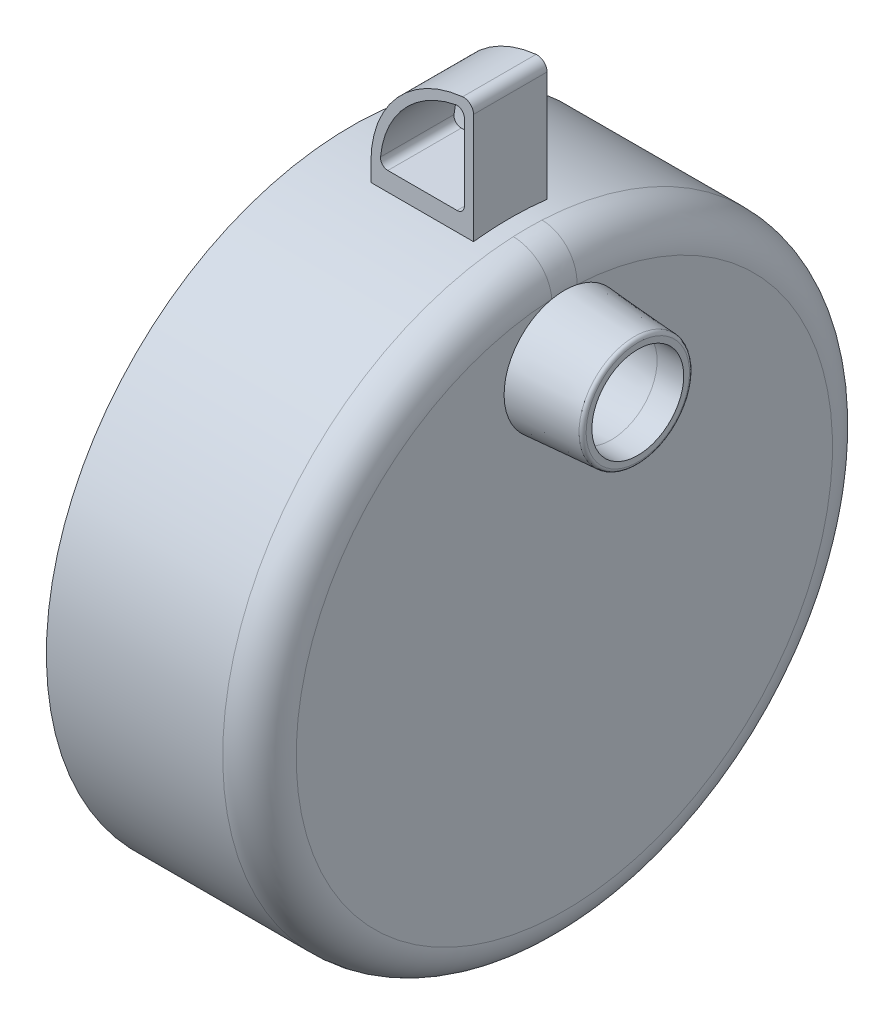
ISO-10303-21;
HEADER;
FILE_DESCRIPTION(('STEP AP214'),'2;1');
FILE_NAME('part.step','',(''),(''),'','','');
FILE_SCHEMA(('AUTOMOTIVE_DESIGN { 1 0 10303 214 1 1 1 1 }'));
ENDSEC;
DATA;
#1=APPLICATION_CONTEXT('core data for automotive mechanical design processes');
#2=APPLICATION_PROTOCOL_DEFINITION('international standard','automotive_design',2000,#1);
#3=PRODUCT_CONTEXT('',#1,'mechanical');
#4=PRODUCT('Part','Part','',(#3));
#5=PRODUCT_RELATED_PRODUCT_CATEGORY('part','',(#4));
#6=PRODUCT_DEFINITION_FORMATION('','',#4);
#7=PRODUCT_DEFINITION_CONTEXT('part definition',#1,'design');
#8=PRODUCT_DEFINITION('design','',#6,#7);
#9=PRODUCT_DEFINITION_SHAPE('','',#8);
#10=(LENGTH_UNIT() NAMED_UNIT(*) SI_UNIT(.MILLI.,.METRE.));
#11=(NAMED_UNIT(*) PLANE_ANGLE_UNIT() SI_UNIT($,.RADIAN.));
#12=(NAMED_UNIT(*) SI_UNIT($,.STERADIAN.) SOLID_ANGLE_UNIT());
#13=UNCERTAINTY_MEASURE_WITH_UNIT(LENGTH_MEASURE(1.E-05),#10,'distance_accuracy_value','');
#14=(GEOMETRIC_REPRESENTATION_CONTEXT(3) GLOBAL_UNCERTAINTY_ASSIGNED_CONTEXT((#13)) GLOBAL_UNIT_ASSIGNED_CONTEXT((#10,
#11,#12)) REPRESENTATION_CONTEXT('',''));
#15=CARTESIAN_POINT('',(0.,0.,0.));
#16=DIRECTION('',(0.,0.,1.));
#17=DIRECTION('',(1.,0.,0.));
#18=AXIS2_PLACEMENT_3D('',#15,#16,#17);
#19=CARTESIAN_POINT('',(0.,0.,0.));
#20=DIRECTION('',(1.,0.,0.));
#21=DIRECTION('',(0.,1.,0.));
#22=AXIS2_PLACEMENT_3D('',#19,#20,#21);
#23=CYLINDRICAL_SURFACE('',#22,8.3);
#24=DIRECTION('',(1.,0.,0.));
#25=VECTOR('',#24,1.);
#26=CARTESIAN_POINT('',(0.,8.23953882204581,1.));
#27=LINE('',#26,#25);
#28=CARTESIAN_POINT('',(-4.92790702664676,8.23953882204581,1.));
#29=VERTEX_POINT('',#28);
#30=CARTESIAN_POINT('',(-2.13404134118542,8.23953882204581,1.));
#31=VERTEX_POINT('',#30);
#32=EDGE_CURVE('E11',#29,#31,#27,.T.);
#33=ORIENTED_EDGE('',*,*,#32,.F.);
#34=CARTESIAN_POINT('',(-4.92790702664676,0.,0.));
#35=DIRECTION('',(-1.,0.,0.));
#36=DIRECTION('',(0.,0.,1.));
#37=AXIS2_PLACEMENT_3D('',#34,#35,#36);
#38=CIRCLE('',#37,8.3);
#39=CARTESIAN_POINT('',(-4.92790702664676,8.23953882204581,-1.));
#40=VERTEX_POINT('',#39);
#41=EDGE_CURVE('E55',#40,#29,#38,.F.);
#42=ORIENTED_EDGE('',*,*,#41,.F.);
#43=DIRECTION('',(1.,0.,0.));
#44=VECTOR('',#43,1.);
#45=CARTESIAN_POINT('',(0.,8.23953882204581,-1.));
#46=LINE('',#45,#44);
#47=CARTESIAN_POINT('',(-2.13404134118542,8.23953882204581,-1.));
#48=VERTEX_POINT('',#47);
#49=EDGE_CURVE('E575',#40,#48,#46,.T.);
#50=ORIENTED_EDGE('',*,*,#49,.T.);
#51=CARTESIAN_POINT('',(-2.13404134118542,0.,0.));
#52=DIRECTION('',(1.,0.,0.));
#53=DIRECTION('',(0.,0.,-1.));
#54=AXIS2_PLACEMENT_3D('',#51,#52,#53);
#55=CIRCLE('',#54,8.3);
#56=EDGE_CURVE('E586',#31,#48,#55,.F.);
#57=ORIENTED_EDGE('',*,*,#56,.F.);
#58=EDGE_LOOP('',(#33,#42,#50,#57));
#59=FACE_BOUND('',#58,.T.);
#60=CARTESIAN_POINT('',(-6.4626213592233,0.,0.));
#61=DIRECTION('',(-1.,0.,0.));
#62=DIRECTION('',(0.,-1.,0.));
#63=AXIS2_PLACEMENT_3D('',#60,#61,#62);
#64=CIRCLE('',#63,8.3);
#65=CARTESIAN_POINT('',(-6.46262135922329,-8.3,0.));
#66=VERTEX_POINT('',#65);
#67=EDGE_CURVE('E350',#66,#66,#64,.F.);
#68=ORIENTED_EDGE('',*,*,#67,.T.);
#69=EDGE_LOOP('',(#68));
#70=FACE_BOUND('',#69,.T.);
#71=CARTESIAN_POINT('',(-0.662621359223303,6.84654717536638,1.16100671717802));
#72=CARTESIAN_POINT('',(-0.155611557138721,8.20548721974094,1.30313866871385));
#73=CARTESIAN_POINT('',(-1.56479130863699,8.13081212811571,1.66730145363292));
#74=CARTESIAN_POINT('',(-0.662621359223303,6.86762956454592,1.13997296968727));
#75=CARTESIAN_POINT('',(-0.187933218919957,8.2057862436735,1.29042295352572));
#76=CARTESIAN_POINT('',(-1.5766915320226,8.14112200606201,1.61704018575949));
#77=CARTESIAN_POINT('',(-0.662621359223303,6.88896873968901,1.11754499626006));
#78=CARTESIAN_POINT('',(-0.219813738758314,8.2072302306618,1.27298407299892));
#79=CARTESIAN_POINT('',(-1.58710683832777,8.15104274715596,1.56627666116589));
#80=CARTESIAN_POINT('',(-0.662621359223303,6.93173915458441,1.06976085770777));
#81=CARTESIAN_POINT('',(-0.28089475284374,8.21175203031184,1.2301985167575));
#82=CARTESIAN_POINT('',(-1.60534684968239,8.17002138232369,1.46404769722416));
#83=CARTESIAN_POINT('',(-0.662621359223303,6.95317026746124,1.04440793610431));
#84=CARTESIAN_POINT('',(-0.310201631106451,8.21478989417577,1.20503272984977));
#85=CARTESIAN_POINT('',(-1.61317438780043,8.17908021221811,1.41258309014192));
#86=CARTESIAN_POINT('',(-0.662621359223303,6.99564286526884,0.990725496239536));
#87=CARTESIAN_POINT('',(-0.365483441209835,8.22184084226538,1.14822231651821));
#88=CARTESIAN_POINT('',(-1.62660828866893,8.19622971749665,1.30940602234005));
#89=CARTESIAN_POINT('',(-0.662621359223303,7.01668577720063,0.962411767494178));
#90=CARTESIAN_POINT('',(-0.391582989344379,8.22583109865152,1.11672349103787));
#91=CARTESIAN_POINT('',(-1.6322257423508,8.20432508115929,1.25769615220306));
#92=CARTESIAN_POINT('',(-0.662621359223303,7.05803723748134,0.902596928567542));
#93=CARTESIAN_POINT('',(-0.440410390807749,8.23428483875145,1.04828434670916));
#94=CARTESIAN_POINT('',(-1.64167170685165,8.21956386786933,1.1539157134018));
#95=CARTESIAN_POINT('',(-0.662621359223303,7.07834556892491,0.871094887210082));
#96=CARTESIAN_POINT('',(-0.46324689434083,8.23874570675295,1.0113978489586));
#97=CARTESIAN_POINT('',(-1.64549969319535,8.22670701139242,1.10184504352294));
#98=CARTESIAN_POINT('',(-0.662621359223303,7.13705342922995,0.772332516972111));
#99=CARTESIAN_POINT('',(-0.525588013164992,8.25200652379648,0.895718174619539));
#100=CARTESIAN_POINT('',(-1.65479387286374,8.24654431684184,0.94623993033339));
#101=CARTESIAN_POINT('',(-0.662621359223303,7.17364155353748,0.700327516842503));
#102=CARTESIAN_POINT('',(-0.561156963494785,8.26104922580889,0.809288891124329));
#103=CARTESIAN_POINT('',(-1.65817921485107,8.25780393925008,0.842365088864946));
#104=CARTESIAN_POINT('',(-0.662621359223303,7.23754127493035,0.544516811971032));
#105=CARTESIAN_POINT('',(-0.618656862721127,8.27693926178484,0.624932201739415));
#106=CARTESIAN_POINT('',(-1.66204845327861,8.27640543033942,0.634090320152695));
#107=CARTESIAN_POINT('',(-0.662621359223303,7.26483975738024,0.460694658387139));
#108=CARTESIAN_POINT('',(-0.641192673353963,8.28391440586742,0.526446296419795));
#109=CARTESIAN_POINT('',(-1.66252826374635,8.28374176860689,0.529689859994));
#110=CARTESIAN_POINT('',(-0.662621359223303,7.29672797286711,0.32416250357436));
#111=CARTESIAN_POINT('',(-0.66640472265956,8.29200872250634,0.3684583559612));
#112=CARTESIAN_POINT('',(-1.66265202187561,8.29206686288999,0.367391544298383));
#113=CARTESIAN_POINT('',(-0.662621359223303,7.30601426689956,0.274287772018961));
#114=CARTESIAN_POINT('',(-0.673499509801504,8.2943639169076,0.311274631978651));
#115=CARTESIAN_POINT('',(-1.66257367385266,8.29442715062154,0.309560744489569));
#116=CARTESIAN_POINT('',(-0.662621359223303,7.31995664012973,0.172981918493362));
#117=CARTESIAN_POINT('',(-0.683989113866572,8.29788672472185,0.195904608572503));
#118=CARTESIAN_POINT('',(-1.6623968653032,8.29793750274279,0.19386274501599));
#119=CARTESIAN_POINT('',(-0.662621359223303,7.32461279760342,0.121550822849825));
#120=CARTESIAN_POINT('',(-0.687422389676236,8.29906696110124,0.137517401754485));
#121=CARTESIAN_POINT('',(-1.66229840511676,8.2990875875919,0.135995545983132));
#122=CARTESIAN_POINT('',(-0.662621359223303,7.32902006068064,0.0182132112604692));
#123=CARTESIAN_POINT('',(-0.690662141607559,8.3001799387181,0.0206137193719886));
#124=CARTESIAN_POINT('',(-1.66220626311005,8.3001767747855,0.0202818642386279));
#125=CARTESIAN_POINT('',(-0.662621359223303,7.3287738843594,-0.0336930252886859));
#126=CARTESIAN_POINT('',(-0.690482646789475,8.3001175029108,-0.0381185169916275));
#127=CARTESIAN_POINT('',(-1.66221252322781,8.30011654818114,-0.03756461217083));
#128=CARTESIAN_POINT('',(-0.662621359223303,7.32339904334591,-0.136892567034595));
#129=CARTESIAN_POINT('',(-0.686526761284036,8.29876033119906,-0.154907593905905));
#130=CARTESIAN_POINT('',(-1.66232225814446,8.29878681201544,-0.153242198123968));
#131=CARTESIAN_POINT('',(-0.662621359223303,7.31827048877096,-0.188185886028688));
#132=CARTESIAN_POINT('',(-0.682735790476447,8.29746059664537,-0.213179441326511));
#133=CARTESIAN_POINT('',(-1.66242573075081,8.29751732972769,-0.2110733079848));
#134=CARTESIAN_POINT('',(-0.662621359223303,7.30335959515059,-0.289557551768222));
#135=CARTESIAN_POINT('',(-0.671477167986518,8.29369157659234,-0.328744202498162));
#136=CARTESIAN_POINT('',(-1.66259758188732,8.29375306719786,-0.32720810222908));
#137=CARTESIAN_POINT('',(-0.662621359223303,7.29353648045817,-0.339621132619031));
#138=CARTESIAN_POINT('',(-0.663935701363731,8.29119848413677,-0.386223715220537));
#139=CARTESIAN_POINT('',(-1.66266564180079,8.29124754478188,-0.38551144046606));
#140=CARTESIAN_POINT('',(-0.662621359223303,7.26976284678463,-0.43714822746393));
#141=CARTESIAN_POINT('',(-0.645090186390456,8.28519059678095,-0.498838258599931));
#142=CARTESIAN_POINT('',(-1.66251081678581,8.28500767611369,-0.502048614806443));
#143=CARTESIAN_POINT('',(-0.662621359223303,7.25581257185804,-0.48461189500406));
#144=CARTESIAN_POINT('',(-0.633718349813224,8.28165585970039,-0.554145373414995));
#145=CARTESIAN_POINT('',(-1.66228794905834,8.28127340252071,-0.560282454815153));
#146=CARTESIAN_POINT('',(-0.662621359223303,7.22447491887314,-0.576282335163892));
#147=CARTESIAN_POINT('',(-0.607099155981249,8.27377877471396,-0.661613320904463));
#148=CARTESIAN_POINT('',(-1.66120606867927,8.27257487381327,-0.676692582985431));
#149=CARTESIAN_POINT('',(-0.662621359223303,7.20708526905994,-0.620486928484705));
#150=CARTESIAN_POINT('',(-0.591756970141739,8.2694129987932,-0.71390031158352));
#151=CARTESIAN_POINT('',(-1.66034663453125,8.26760980518949,-0.734868807428296));
#152=CARTESIAN_POINT('',(-0.662621359223303,7.16964505295335,-0.705230802852959));
#153=CARTESIAN_POINT('',(-0.557131698388861,8.26018219107196,-0.814478049972663));
#154=CARTESIAN_POINT('',(-1.65756519228554,8.25645620284806,-0.851082819651797));
#155=CARTESIAN_POINT('',(-0.662621359223303,7.14959387362144,-0.745769235834291));
#156=CARTESIAN_POINT('',(-0.537734061206939,8.25529577106546,-0.862845241322704));
#157=CARTESIAN_POINT('',(-1.6556429390615,8.25026738709956,-0.909120572393166));
#158=CARTESIAN_POINT('',(-0.662621359223303,7.12860138473197,-0.784277410188486));
#159=CARTESIAN_POINT('',(-0.516502929648898,8.25037436531626,-0.908203678044989));
#160=CARTESIAN_POINT('',(-1.65297635503683,8.24347047665014,-0.967054548925488));
#161=(BOUNDED_SURFACE() B_SPLINE_SURFACE(3,2,((#71,#72,#73),(#74,#75,#76),(#77,#78,#79),(#80,
#81,#82),(#83,#84,#85),(#86,#87,#88),(#89,#90,#91),(#92,#93,#94),(#95,#96,#97),(#98,#99,#100),
(#101,#102,#103),(#104,#105,#106),(#107,#108,#109),(#110,#111,#112),(#113,#114,#115),(#116,#117,
#118),(#119,#120,#121),(#122,#123,#124),(#125,#126,#127),(#128,#129,#130),(#131,#132,#133),
(#134,#135,#136),(#137,#138,#139),(#140,#141,#142),(#143,#144,#145),(#146,#147,#148),(#149,#150,
#151),(#152,#153,#154),(#155,#156,#157),(#158,#159,#160)),.UNSPECIFIED.,.F.,.F.,
.F.) B_SPLINE_SURFACE_WITH_KNOTS((4,2,2,2,2,2,2,2,2,2,2,2,2,2,4),(3,3),(0.,0.139941172452197,
0.279728627086322,0.418805350431166,0.557922810278403,0.833609871727557,1.10968453476691,
1.2623917495121,1.41509638258205,1.56771635166655,1.72033287863789,1.87429977208202,
2.02825756270266,2.18231738624994,2.33641275666058),(0.,1.),
.UNSPECIFIED.) GEOMETRIC_REPRESENTATION_ITEM() RATIONAL_B_SPLINE_SURFACE(((1.,0.565777905487818,
1.),(1.,0.573689745474417,1.),(1.,0.58145009723539,1.),(1.,0.596584463743596,1.),(1.,
0.603958893497654,1.),(1.,0.618219420583855,1.),(1.,0.62510781014411,1.),(1.,0.638358565376088,
1.),(1.,0.644720776380912,1.),(1.,0.6627764103191,1.),(1.,0.673572102667507,1.),(1.,
0.692000098273899,1.),(1.,0.699627932632538,1.),(1.,0.708440956889833,1.),(1.,0.710981950504074,
1.),(1.,0.714783723458857,1.),(1.,0.716044524442035,1.),(1.,0.717238160754179,1.),(1.,
0.717171731959198,1.),(1.,0.715715473361174,1.),(1.,0.714325673405479,1.),(1.,0.710255823608474,
1.),(1.,0.707564466311527,1.),(1.,0.700980796296435,1.),(1.,0.697088554590528,1.),(1.,
0.688221245026871,1.),(1.,0.683245461253902,1.),(1.,0.672344594067267,1.),(1.,0.666419291882653,
1.),(1.,0.66008643519388,1.))) REPRESENTATION_ITEM('') SURFACE());
#162=CARTESIAN_POINT('',(-1.56479130863699,8.13081212811571,1.66730145363292));
#163=CARTESIAN_POINT('',(-1.5766915320226,8.14112200606201,1.61704018575949));
#164=CARTESIAN_POINT('',(-1.58710683832777,8.15104274715596,1.56627666116589));
#165=CARTESIAN_POINT('',(-1.60534684968239,8.17002138232369,1.46404769722416));
#166=CARTESIAN_POINT('',(-1.61317438780043,8.17908021221811,1.41258309014192));
#167=CARTESIAN_POINT('',(-1.62660828866893,8.19622971749665,1.30940602234005));
#168=CARTESIAN_POINT('',(-1.6322257423508,8.20432508115929,1.25769615220306));
#169=CARTESIAN_POINT('',(-1.64167170685165,8.21956386786933,1.1539157134018));
#170=CARTESIAN_POINT('',(-1.64549969319535,8.22670701139242,1.10184504352294));
#171=CARTESIAN_POINT('',(-1.65479387286374,8.24654431684184,0.94623993033339));
#172=CARTESIAN_POINT('',(-1.65817921485107,8.25780393925008,0.842365088864946));
#173=CARTESIAN_POINT('',(-1.66204845327861,8.27640543033942,0.634090320152695));
#174=CARTESIAN_POINT('',(-1.66252826374635,8.28374176860689,0.529689859994));
#175=CARTESIAN_POINT('',(-1.66265202187561,8.29206686288999,0.367391544298383));
#176=CARTESIAN_POINT('',(-1.66257367385266,8.29442715062154,0.309560744489569));
#177=CARTESIAN_POINT('',(-1.6623968653032,8.29793750274279,0.19386274501599));
#178=CARTESIAN_POINT('',(-1.66229840511676,8.2990875875919,0.135995545983132));
#179=CARTESIAN_POINT('',(-1.66220626311005,8.3001767747855,0.0202818642386279));
#180=CARTESIAN_POINT('',(-1.66221252322781,8.30011654818114,-0.03756461217083));
#181=CARTESIAN_POINT('',(-1.66232225814446,8.29878681201544,-0.153242198123968));
#182=CARTESIAN_POINT('',(-1.66242573075081,8.29751732972769,-0.2110733079848));
#183=CARTESIAN_POINT('',(-1.66259758188732,8.29375306719786,-0.327208102229081));
#184=CARTESIAN_POINT('',(-1.66266564180079,8.29124754478188,-0.38551144046606));
#185=CARTESIAN_POINT('',(-1.66251081678581,8.28500767611369,-0.502048614806443));
#186=CARTESIAN_POINT('',(-1.66228794905834,8.28127340252071,-0.560282454815154));
#187=CARTESIAN_POINT('',(-1.66120606867927,8.27257487381327,-0.676692582985431));
#188=CARTESIAN_POINT('',(-1.66034663453125,8.26760980518949,-0.734868807428296));
#189=CARTESIAN_POINT('',(-1.65756519228554,8.25645620284805,-0.851082819651797));
#190=CARTESIAN_POINT('',(-1.6556429390615,8.25026738709956,-0.909120572393166));
#191=CARTESIAN_POINT('',(-1.65297635503683,8.24347047665014,-0.967054548925488));
#192=B_SPLINE_CURVE_WITH_KNOTS('',3,(#162,#163,#164,#165,#166,#167,#168,#169,#170,#171,#172,
#173,#174,#175,#176,#177,#178,#179,#180,#181,#182,#183,#184,#185,#186,#187,#188,#189,#190,#191),
.UNSPECIFIED.,.F.,.F.,(4,2,2,2,2,2,2,2,2,2,2,2,2,2,4),(0.,0.139941172452197,0.279728627086322,
0.418805350431166,0.557922810278403,0.833609871727557,1.10968453476691,1.2623917495121,
1.41509638258205,1.56771635166655,1.72033287863789,1.87429977208202,2.02825756270266,
2.18231738624994,2.33641275666058),.UNSPECIFIED.);
#193=CARTESIAN_POINT('',(-1.6626213592233,8.2908022449924,0.39063811184897));
#194=VERTEX_POINT('',#193);
#195=CARTESIAN_POINT('',(-1.6626213592233,8.2908022449924,-0.39063811184897));
#196=VERTEX_POINT('',#195);
#197=EDGE_CURVE('E283',#194,#196,#192,.T.);
#198=ORIENTED_EDGE('',*,*,#197,.T.);
#199=CARTESIAN_POINT('',(-1.6626213592233,0.,0.));
#200=DIRECTION('',(1.,0.,0.));
#201=DIRECTION('',(0.,1.,0.));
#202=AXIS2_PLACEMENT_3D('',#199,#200,#201);
#203=CIRCLE('',#202,8.3);
#204=EDGE_CURVE('E293',#196,#194,#203,.F.);
#205=ORIENTED_EDGE('',*,*,#204,.T.);
#206=EDGE_LOOP('',(#198,#205));
#207=FACE_BOUND('',#206,.T.);
#208=ADVANCED_FACE('F45',(#59,#70,#207),#23,.T.);
#209=CARTESIAN_POINT('',(-0.662621359223303,8.3,0.));
#210=DIRECTION('',(1.,0.,0.));
#211=DIRECTION('',(0.,1.,0.));
#212=AXIS2_PLACEMENT_3D('',#209,#210,#211);
#213=PLANE('',#212);
#214=CARTESIAN_POINT('',(-0.662621359223303,5.68845248560959,0.));
#215=DIRECTION('',(1.,0.,0.));
#216=DIRECTION('',(0.,1.,0.));
#217=AXIS2_PLACEMENT_3D('',#214,#215,#216);
#218=CIRCLE('',#217,1.63985362388701);
#219=CARTESIAN_POINT('',(-0.662621359223303,7.29191040824633,0.343573279096082));
#220=VERTEX_POINT('',#219);
#221=CARTESIAN_POINT('',(-0.662621359223303,7.29191040824633,-0.343573279096082));
#222=VERTEX_POINT('',#221);
#223=EDGE_CURVE('E273',#220,#222,#218,.T.);
#224=ORIENTED_EDGE('',*,*,#223,.F.);
#225=CARTESIAN_POINT('',(-0.662621359223302,0.,0.));
#226=DIRECTION('',(1.,0.,0.));
#227=DIRECTION('',(0.,1.,0.));
#228=AXIS2_PLACEMENT_3D('',#225,#226,#227);
#229=CIRCLE('',#228,7.3);
#230=EDGE_CURVE('E277',#220,#222,#229,.T.);
#231=ORIENTED_EDGE('',*,*,#230,.T.);
#232=EDGE_LOOP('',(#224,#231));
#233=FACE_BOUND('',#232,.T.);
#234=ADVANCED_FACE('F300',(#233),#213,.T.);
#235=CARTESIAN_POINT('',(1.3373786407767,0.,0.));
#236=DIRECTION('',(1.,0.,0.));
#237=DIRECTION('',(0.,1.,0.));
#238=AXIS2_PLACEMENT_3D('',#235,#236,#237);
#239=PLANE('',#238);
#240=CARTESIAN_POINT('',(1.3373786407767,5.6884524856096,0.));
#241=DIRECTION('',(1.,0.,0.));
#242=DIRECTION('',(0.,1.,0.));
#243=AXIS2_PLACEMENT_3D('',#240,#241,#242);
#244=CIRCLE('',#243,1.40674849138623);
#245=CARTESIAN_POINT('',(1.3373786407767,7.09520097699583,0.));
#246=VERTEX_POINT('',#245);
#247=EDGE_CURVE('E343',#246,#246,#244,.T.);
#248=ORIENTED_EDGE('',*,*,#247,.T.);
#249=EDGE_LOOP('',(#248));
#250=FACE_BOUND('',#249,.T.);
#251=CARTESIAN_POINT('',(1.3373786407767,5.68845248560959,0.));
#252=DIRECTION('',(1.,0.,0.));
#253=DIRECTION('',(0.,0.,-1.));
#254=AXIS2_PLACEMENT_3D('',#251,#252,#253);
#255=CIRCLE('',#254,1.25);
#256=CARTESIAN_POINT('',(1.3373786407767,5.68845248560959,-1.25));
#257=VERTEX_POINT('',#256);
#258=EDGE_CURVE('E259',#257,#257,#255,.T.);
#259=ORIENTED_EDGE('',*,*,#258,.F.);
#260=EDGE_LOOP('',(#259));
#261=FACE_BOUND('',#260,.T.);
#262=ADVANCED_FACE('F363',(#250,#261),#239,.T.);
#263=CARTESIAN_POINT('',(-0.6626213592233,5.68845248560959,0.));
#264=DIRECTION('',(-1.,0.,0.));
#265=DIRECTION('',(0.,-1.,0.));
#266=AXIS2_PLACEMENT_3D('',#263,#264,#265);
#267=CONICAL_SURFACE('',#266,1.63985362388701,0.0698131700797662);
#268=CARTESIAN_POINT('',(1.24435428815111,5.6884524856096,0.));
#269=DIRECTION('',(1.,0.,0.));
#270=DIRECTION('',(0.,1.,0.));
#271=AXIS2_PLACEMENT_3D('',#268,#269,#270);
#272=CIRCLE('',#271,1.50650489641222);
#273=CARTESIAN_POINT('',(1.24435428815111,7.19495738202181,0.));
#274=VERTEX_POINT('',#273);
#275=EDGE_CURVE('E325',#274,#274,#272,.F.);
#276=ORIENTED_EDGE('',*,*,#275,.T.);
#277=EDGE_LOOP('',(#276));
#278=FACE_BOUND('',#277,.T.);
#279=ORIENTED_EDGE('',*,*,#223,.T.);
#280=EDGE_CURVE('E272',#222,#220,#218,.T.);
#281=ORIENTED_EDGE('',*,*,#280,.T.);
#282=EDGE_LOOP('',(#279,#281));
#283=FACE_BOUND('',#282,.T.);
#284=ADVANCED_FACE('F360',(#278,#283),#267,.T.);
#285=CARTESIAN_POINT('',(0.,0.,0.));
#286=DIRECTION('',(1.,0.,0.));
#287=DIRECTION('',(0.,1.,0.));
#288=AXIS2_PLACEMENT_3D('',#285,#286,#287);
#289=CYLINDRICAL_SURFACE('',#288,8.);
#290=CARTESIAN_POINT('',(-6.1626213592233,0.,0.));
#291=DIRECTION('',(-1.,0.,0.));
#292=DIRECTION('',(0.,-1.,0.));
#293=AXIS2_PLACEMENT_3D('',#290,#291,#292);
#294=CIRCLE('',#293,8.);
#295=CARTESIAN_POINT('',(-6.1626213592233,-8.,0.));
#296=VERTEX_POINT('',#295);
#297=EDGE_CURVE('E587',#296,#296,#294,.T.);
#298=ORIENTED_EDGE('',*,*,#297,.T.);
#299=EDGE_LOOP('',(#298));
#300=FACE_BOUND('',#299,.T.);
#301=CARTESIAN_POINT('',(-0.962621359223302,0.,0.));
#302=DIRECTION('',(1.,0.,0.));
#303=DIRECTION('',(0.,1.,0.));
#304=AXIS2_PLACEMENT_3D('',#301,#302,#303);
#305=CIRCLE('',#304,8.);
#306=CARTESIAN_POINT('',(-0.962621359223303,8.,0.));
#307=VERTEX_POINT('',#306);
#308=EDGE_CURVE('E264',#307,#307,#305,.T.);
#309=ORIENTED_EDGE('',*,*,#308,.T.);
#310=EDGE_LOOP('',(#309));
#311=FACE_BOUND('',#310,.T.);
#312=ADVANCED_FACE('F371',(#300,#311),#289,.F.);
#313=CARTESIAN_POINT('',(-0.962621359223303,8.3,0.));
#314=DIRECTION('',(1.,0.,0.));
#315=DIRECTION('',(0.,1.,0.));
#316=AXIS2_PLACEMENT_3D('',#313,#314,#315);
#317=PLANE('',#316);
#318=CARTESIAN_POINT('',(-0.962621359223303,5.68845248560959,0.));
#319=DIRECTION('',(1.,0.,0.));
#320=DIRECTION('',(0.,1.,0.));
#321=AXIS2_PLACEMENT_3D('',#318,#319,#320);
#322=CIRCLE('',#321,1.36009909804571);
#323=CARTESIAN_POINT('',(-0.962621359223303,7.0485515836553,0.));
#324=VERTEX_POINT('',#323);
#325=EDGE_CURVE('E268',#324,#324,#322,.T.);
#326=ORIENTED_EDGE('',*,*,#325,.T.);
#327=EDGE_LOOP('',(#326));
#328=FACE_BOUND('',#327,.T.);
#329=ORIENTED_EDGE('',*,*,#308,.F.);
#330=EDGE_LOOP('',(#329));
#331=FACE_BOUND('',#330,.T.);
#332=ADVANCED_FACE('F378',(#328,#331),#317,.F.);
#333=CARTESIAN_POINT('',(-0.683548301346536,5.68845248560959,0.));
#334=DIRECTION('',(-1.,0.,0.));
#335=DIRECTION('',(0.,-1.,0.));
#336=AXIS2_PLACEMENT_3D('',#333,#334,#335);
#337=CONICAL_SURFACE('',#336,1.34058440880906,0.0698131700797662);
#338=CARTESIAN_POINT('',(0.611869097093518,5.68845248560959,0.));
#339=DIRECTION('',(-1.,0.,0.));
#340=DIRECTION('',(0.,-1.,0.));
#341=AXIS2_PLACEMENT_3D('',#338,#339,#340);
#342=CIRCLE('',#341,1.25);
#343=CARTESIAN_POINT('',(0.611869097093518,4.43845248560959,0.));
#344=VERTEX_POINT('',#343);
#345=EDGE_CURVE('E263',#344,#344,#342,.F.);
#346=ORIENTED_EDGE('',*,*,#345,.T.);
#347=EDGE_LOOP('',(#346));
#348=FACE_BOUND('',#347,.T.);
#349=ORIENTED_EDGE('',*,*,#325,.F.);
#350=EDGE_LOOP('',(#349));
#351=FACE_BOUND('',#350,.T.);
#352=ADVANCED_FACE('F375',(#348,#351),#337,.F.);
#353=CARTESIAN_POINT('',(-8.6626213592233,5.68845248560959,0.));
#354=DIRECTION('',(1.,0.,0.));
#355=DIRECTION('',(0.,0.,-1.));
#356=AXIS2_PLACEMENT_3D('',#353,#354,#355);
#357=CYLINDRICAL_SURFACE('',#356,1.25);
#358=ORIENTED_EDGE('',*,*,#258,.T.);
#359=EDGE_LOOP('',(#358));
#360=FACE_BOUND('',#359,.T.);
#361=ORIENTED_EDGE('',*,*,#345,.F.);
#362=EDGE_LOOP('',(#361));
#363=FACE_BOUND('',#362,.T.);
#364=ADVANCED_FACE('F331',(#360,#363),#357,.F.);
#365=CARTESIAN_POINT('',(-1.6626213592233,0.,0.));
#366=DIRECTION('',(1.,0.,0.));
#367=DIRECTION('',(0.,1.,0.));
#368=AXIS2_PLACEMENT_3D('',#365,#366,#367);
#369=TOROIDAL_SURFACE('',#368,7.3,1.);
#370=CARTESIAN_POINT('',(-1.6626213592233,7.29191040824633,0.343573279096082));
#371=DIRECTION('',(0.,0.0470648327528879,-0.998891836746073));
#372=DIRECTION('',(0.,0.998891836746073,0.0470648327528879));
#373=AXIS2_PLACEMENT_3D('',#370,#371,#372);
#374=CIRCLE('',#373,1.);
#375=EDGE_CURVE('E245',#194,#220,#374,.T.);
#376=ORIENTED_EDGE('',*,*,#375,.F.);
#377=ORIENTED_EDGE('',*,*,#204,.F.);
#378=CARTESIAN_POINT('',(-1.6626213592233,7.29191040824633,-0.343573279096082));
#379=DIRECTION('',(0.,0.0470648327528879,0.998891836746073));
#380=DIRECTION('',(0.,-0.998891836746073,0.0470648327528879));
#381=AXIS2_PLACEMENT_3D('',#378,#379,#380);
#382=CIRCLE('',#381,1.);
#383=EDGE_CURVE('E70',#222,#196,#382,.T.);
#384=ORIENTED_EDGE('',*,*,#383,.F.);
#385=ORIENTED_EDGE('',*,*,#230,.F.);
#386=EDGE_LOOP('',(#376,#377,#384,#385));
#387=FACE_BOUND('',#386,.T.);
#388=ADVANCED_FACE('F311',(#387),#369,.T.);
#389=ORIENTED_EDGE('',*,*,#383,.T.);
#390=ORIENTED_EDGE('',*,*,#197,.F.);
#391=ORIENTED_EDGE('',*,*,#375,.T.);
#392=ORIENTED_EDGE('',*,*,#280,.F.);
#393=EDGE_LOOP('',(#389,#390,#391,#392));
#394=FACE_BOUND('',#393,.T.);
#395=ADVANCED_FACE('F305',(#394),#161,.T.);
#396=CARTESIAN_POINT('',(1.2373786407767,5.6884524856096,0.));
#397=DIRECTION('',(1.,0.,0.));
#398=DIRECTION('',(0.,1.,0.));
#399=AXIS2_PLACEMENT_3D('',#396,#397,#398);
#400=TOROIDAL_SURFACE('',#399,1.40674849138623,0.1);
#401=ORIENTED_EDGE('',*,*,#247,.F.);
#402=EDGE_LOOP('',(#401));
#403=FACE_BOUND('',#402,.T.);
#404=ORIENTED_EDGE('',*,*,#275,.F.);
#405=EDGE_LOOP('',(#404));
#406=FACE_BOUND('',#405,.T.);
#407=ADVANCED_FACE('F310',(#403,#406),#400,.T.);
#408=CARTESIAN_POINT('',(-6.6626213592233,0.,0.));
#409=DIRECTION('',(-1.,0.,0.));
#410=DIRECTION('',(0.,-1.,0.));
#411=AXIS2_PLACEMENT_3D('',#408,#409,#410);
#412=CONICAL_SURFACE('',#411,8.50000000000001,0.785398163397453);
#413=ORIENTED_EDGE('',*,*,#297,.F.);
#414=EDGE_LOOP('',(#413));
#415=FACE_BOUND('',#414,.T.);
#416=ORIENTED_EDGE('',*,*,#67,.F.);
#417=EDGE_LOOP('',(#416));
#418=FACE_BOUND('',#417,.T.);
#419=ADVANCED_FACE('F48',(#415,#418),#412,.F.);
#420=CARTESIAN_POINT('',(-2.40318341655399,11.2406707001855,1.));
#421=DIRECTION('',(0.,0.,-1.));
#422=DIRECTION('',(-1.,0.,0.));
#423=AXIS2_PLACEMENT_3D('',#420,#421,#422);
#424=CYLINDRICAL_SURFACE('',#423,0.269142075368574);
#425=CARTESIAN_POINT('',(-2.40318341655399,11.2406707001855,-1.));
#426=DIRECTION('',(0.,0.,1.));
#427=DIRECTION('',(1.,0.,0.));
#428=AXIS2_PLACEMENT_3D('',#425,#426,#427);
#429=CIRCLE('',#428,0.269142075368574);
#430=CARTESIAN_POINT('',(-2.4318746588128,11.5082791255972,-1.));
#431=VERTEX_POINT('',#430);
#432=CARTESIAN_POINT('',(-2.13404134118542,11.2406707001855,-1.));
#433=VERTEX_POINT('',#432);
#434=EDGE_CURVE('E227',#431,#433,#429,.F.);
#435=ORIENTED_EDGE('',*,*,#434,.F.);
#436=DIRECTION('',(0.,0.,-1.));
#437=VECTOR('',#436,1.);
#438=CARTESIAN_POINT('',(-2.4318746588128,11.5082791255972,1.));
#439=LINE('',#438,#437);
#440=CARTESIAN_POINT('',(-2.4318746588128,11.5082791255972,1.));
#441=VERTEX_POINT('',#440);
#442=EDGE_CURVE('E242',#441,#431,#439,.T.);
#443=ORIENTED_EDGE('',*,*,#442,.F.);
#444=CARTESIAN_POINT('',(-2.40318341655399,11.2406707001855,1.));
#445=DIRECTION('',(0.,0.,1.));
#446=DIRECTION('',(1.,0.,0.));
#447=AXIS2_PLACEMENT_3D('',#444,#445,#446);
#448=CIRCLE('',#447,0.269142075368574);
#449=CARTESIAN_POINT('',(-2.13404134118542,11.2406707001855,1.));
#450=VERTEX_POINT('',#449);
#451=EDGE_CURVE('E190',#441,#450,#448,.F.);
#452=ORIENTED_EDGE('',*,*,#451,.T.);
#453=DIRECTION('',(0.,0.,-1.));
#454=VECTOR('',#453,1.);
#455=CARTESIAN_POINT('',(-2.13404134118542,11.2406707001855,1.));
#456=LINE('',#455,#454);
#457=EDGE_CURVE('E155',#450,#433,#456,.T.);
#458=ORIENTED_EDGE('',*,*,#457,.T.);
#459=EDGE_LOOP('',(#435,#443,#452,#458));
#460=FACE_BOUND('',#459,.T.);
#461=ADVANCED_FACE('F338',(#460),#424,.T.);
#462=CARTESIAN_POINT('',(-2.13404134118542,8.73033370077161,1.));
#463=DIRECTION('',(0.,0.,-1.));
#464=DIRECTION('',(-1.,0.,0.));
#465=AXIS2_PLACEMENT_3D('',#462,#463,#464);
#466=CYLINDRICAL_SURFACE('',#465,2.79386568546134);
#467=CARTESIAN_POINT('',(-2.13404134118542,8.73033370077161,-1.));
#468=DIRECTION('',(0.,0.,1.));
#469=DIRECTION('',(1.,0.,0.));
#470=AXIS2_PLACEMENT_3D('',#467,#468,#469);
#471=CIRCLE('',#470,2.79386568546134);
#472=CARTESIAN_POINT('',(-4.92790702664676,8.73033370077161,-1.));
#473=VERTEX_POINT('',#472);
#474=EDGE_CURVE('E230',#473,#431,#471,.F.);
#475=ORIENTED_EDGE('',*,*,#474,.F.);
#476=DIRECTION('',(0.,0.,-1.));
#477=VECTOR('',#476,1.);
#478=CARTESIAN_POINT('',(-4.92790702664676,8.73033370077161,1.));
#479=LINE('',#478,#477);
#480=CARTESIAN_POINT('',(-4.92790702664676,8.73033370077161,1.));
#481=VERTEX_POINT('',#480);
#482=EDGE_CURVE('E238',#481,#473,#479,.T.);
#483=ORIENTED_EDGE('',*,*,#482,.F.);
#484=CARTESIAN_POINT('',(-2.13404134118542,8.73033370077161,1.));
#485=DIRECTION('',(0.,0.,1.));
#486=DIRECTION('',(1.,0.,0.));
#487=AXIS2_PLACEMENT_3D('',#484,#485,#486);
#488=CIRCLE('',#487,2.79386568546134);
#489=EDGE_CURVE('E194',#481,#441,#488,.F.);
#490=ORIENTED_EDGE('',*,*,#489,.T.);
#491=ORIENTED_EDGE('',*,*,#442,.T.);
#492=EDGE_LOOP('',(#475,#483,#490,#491));
#493=FACE_BOUND('',#492,.T.);
#494=ADVANCED_FACE('F413',(#493),#466,.T.);
#495=CARTESIAN_POINT('',(-4.92790702664676,0.,1.));
#496=DIRECTION('',(-1.,0.,0.));
#497=DIRECTION('',(0.,0.,1.));
#498=AXIS2_PLACEMENT_3D('',#495,#496,#497);
#499=PLANE('',#498);
#500=DIRECTION('',(0.,1.,0.));
#501=VECTOR('',#500,1.);
#502=CARTESIAN_POINT('',(-4.92790702664676,0.,-1.));
#503=LINE('',#502,#501);
#504=EDGE_CURVE('E175',#40,#473,#503,.T.);
#505=ORIENTED_EDGE('',*,*,#504,.F.);
#506=ORIENTED_EDGE('',*,*,#41,.T.);
#507=DIRECTION('',(0.,1.,0.));
#508=VECTOR('',#507,1.);
#509=CARTESIAN_POINT('',(-4.92790702664676,0.,1.));
#510=LINE('',#509,#508);
#511=EDGE_CURVE('E198',#29,#481,#510,.T.);
#512=ORIENTED_EDGE('',*,*,#511,.T.);
#513=ORIENTED_EDGE('',*,*,#482,.T.);
#514=EDGE_LOOP('',(#505,#506,#512,#513));
#515=FACE_BOUND('',#514,.T.);
#516=ADVANCED_FACE('F391',(#515),#499,.T.);
#517=CARTESIAN_POINT('',(-4.46731973684008,8.95286073251019,1.));
#518=DIRECTION('',(0.,0.,-1.));
#519=DIRECTION('',(-1.,0.,0.));
#520=AXIS2_PLACEMENT_3D('',#517,#518,#519);
#521=CYLINDRICAL_SURFACE('',#520,0.199999999999999);
#522=CARTESIAN_POINT('',(-4.46731973684008,8.95286073251019,-1.));
#523=DIRECTION('',(0.,0.,1.));
#524=DIRECTION('',(1.,0.,0.));
#525=AXIS2_PLACEMENT_3D('',#522,#523,#524);
#526=CIRCLE('',#525,0.199999999999999);
#527=CARTESIAN_POINT('',(-4.66641633270116,8.97184876865226,-1.));
#528=VERTEX_POINT('',#527);
#529=CARTESIAN_POINT('',(-4.46731973684008,8.75286073251019,-1.));
#530=VERTEX_POINT('',#529);
#531=EDGE_CURVE('E151',#528,#530,#526,.T.);
#532=ORIENTED_EDGE('',*,*,#531,.F.);
#533=DIRECTION('',(0.,0.,-1.));
#534=VECTOR('',#533,1.);
#535=CARTESIAN_POINT('',(-4.66641633270116,8.97184876865226,1.));
#536=LINE('',#535,#534);
#537=CARTESIAN_POINT('',(-4.66641633270116,8.97184876865226,1.));
#538=VERTEX_POINT('',#537);
#539=EDGE_CURVE('E144',#538,#528,#536,.T.);
#540=ORIENTED_EDGE('',*,*,#539,.F.);
#541=CARTESIAN_POINT('',(-4.46731973684008,8.95286073251019,1.));
#542=DIRECTION('',(0.,0.,1.));
#543=DIRECTION('',(1.,0.,0.));
#544=AXIS2_PLACEMENT_3D('',#541,#542,#543);
#545=CIRCLE('',#544,0.199999999999999);
#546=CARTESIAN_POINT('',(-4.46731973684008,8.75286073251019,1.));
#547=VERTEX_POINT('',#546);
#548=EDGE_CURVE('E148',#538,#547,#545,.T.);
#549=ORIENTED_EDGE('',*,*,#548,.T.);
#550=DIRECTION('',(0.,0.,-1.));
#551=VECTOR('',#550,1.);
#552=CARTESIAN_POINT('',(-4.46731973684008,8.75286073251019,1.));
#553=LINE('',#552,#551);
#554=EDGE_CURVE('E205',#547,#530,#553,.T.);
#555=ORIENTED_EDGE('',*,*,#554,.T.);
#556=EDGE_LOOP('',(#532,#540,#549,#555));
#557=FACE_BOUND('',#556,.T.);
#558=ADVANCED_FACE('F146',(#557),#521,.F.);
#559=CARTESIAN_POINT('',(-2.13404134118542,8.73033370077161,1.));
#560=DIRECTION('',(0.,0.,-1.));
#561=DIRECTION('',(-1.,0.,0.));
#562=AXIS2_PLACEMENT_3D('',#559,#560,#561);
#563=CYLINDRICAL_SURFACE('',#562,2.54386568546135);
#564=CARTESIAN_POINT('',(-2.13404134118542,8.73033370077161,-1.));
#565=DIRECTION('',(0.,0.,1.));
#566=DIRECTION('',(1.,0.,0.));
#567=AXIS2_PLACEMENT_3D('',#564,#565,#566);
#568=CIRCLE('',#567,2.54386568546135);
#569=CARTESIAN_POINT('',(-2.62243944588837,11.2268752920515,-1.));
#570=VERTEX_POINT('',#569);
#571=EDGE_CURVE('E208',#528,#570,#568,.F.);
#572=ORIENTED_EDGE('',*,*,#571,.T.);
#573=DIRECTION('',(0.,0.,-1.));
#574=VECTOR('',#573,1.);
#575=CARTESIAN_POINT('',(-2.62243944588837,11.2268752920515,1.));
#576=LINE('',#575,#574);
#577=CARTESIAN_POINT('',(-2.62243944588837,11.2268752920515,1.));
#578=VERTEX_POINT('',#577);
#579=EDGE_CURVE('E156',#578,#570,#576,.T.);
#580=ORIENTED_EDGE('',*,*,#579,.F.);
#581=CARTESIAN_POINT('',(-2.13404134118542,8.73033370077161,1.));
#582=DIRECTION('',(0.,0.,1.));
#583=DIRECTION('',(1.,0.,0.));
#584=AXIS2_PLACEMENT_3D('',#581,#582,#583);
#585=CIRCLE('',#584,2.54386568546135);
#586=EDGE_CURVE('E159',#538,#578,#585,.F.);
#587=ORIENTED_EDGE('',*,*,#586,.F.);
#588=ORIENTED_EDGE('',*,*,#539,.T.);
#589=EDGE_LOOP('',(#572,#580,#587,#588));
#590=FACE_BOUND('',#589,.T.);
#591=ADVANCED_FACE('F160',(#590),#563,.F.);
#592=CARTESIAN_POINT('',(-2.58404134118542,11.0305959361446,1.));
#593=DIRECTION('',(0.,0.,-1.));
#594=DIRECTION('',(-1.,0.,0.));
#595=AXIS2_PLACEMENT_3D('',#592,#593,#594);
#596=CYLINDRICAL_SURFACE('',#595,0.199999999999999);
#597=CARTESIAN_POINT('',(-2.58404134118542,11.0305959361446,-1.));
#598=DIRECTION('',(0.,0.,1.));
#599=DIRECTION('',(1.,0.,0.));
#600=AXIS2_PLACEMENT_3D('',#597,#598,#599);
#601=CIRCLE('',#600,0.199999999999999);
#602=CARTESIAN_POINT('',(-2.38404134118542,11.0305959361446,-1.));
#603=VERTEX_POINT('',#602);
#604=EDGE_CURVE('E211',#570,#603,#601,.F.);
#605=ORIENTED_EDGE('',*,*,#604,.T.);
#606=DIRECTION('',(0.,0.,-1.));
#607=VECTOR('',#606,1.);
#608=CARTESIAN_POINT('',(-2.38404134118542,11.0305959361446,1.));
#609=LINE('',#608,#607);
#610=CARTESIAN_POINT('',(-2.38404134118542,11.0305959361446,1.));
#611=VERTEX_POINT('',#610);
#612=EDGE_CURVE('E254',#611,#603,#609,.T.);
#613=ORIENTED_EDGE('',*,*,#612,.F.);
#614=CARTESIAN_POINT('',(-2.58404134118542,11.0305959361446,1.));
#615=DIRECTION('',(0.,0.,1.));
#616=DIRECTION('',(1.,0.,0.));
#617=AXIS2_PLACEMENT_3D('',#614,#615,#616);
#618=CIRCLE('',#617,0.199999999999999);
#619=EDGE_CURVE('E165',#578,#611,#618,.F.);
#620=ORIENTED_EDGE('',*,*,#619,.F.);
#621=ORIENTED_EDGE('',*,*,#579,.T.);
#622=EDGE_LOOP('',(#605,#613,#620,#621));
#623=FACE_BOUND('',#622,.T.);
#624=ADVANCED_FACE('F394',(#623),#596,.F.);
#625=CARTESIAN_POINT('',(-2.38404134118542,0.,1.));
#626=DIRECTION('',(-1.,0.,0.));
#627=DIRECTION('',(0.,0.,1.));
#628=AXIS2_PLACEMENT_3D('',#625,#626,#627);
#629=PLANE('',#628);
#630=DIRECTION('',(0.,1.,0.));
#631=VECTOR('',#630,1.);
#632=CARTESIAN_POINT('',(-2.38404134118542,0.,-1.));
#633=LINE('',#632,#631);
#634=CARTESIAN_POINT('',(-2.38404134118542,8.95286073251019,-1.));
#635=VERTEX_POINT('',#634);
#636=EDGE_CURVE('E215',#635,#603,#633,.T.);
#637=ORIENTED_EDGE('',*,*,#636,.F.);
#638=DIRECTION('',(0.,0.,-1.));
#639=VECTOR('',#638,1.);
#640=CARTESIAN_POINT('',(-2.38404134118542,8.95286073251019,1.));
#641=LINE('',#640,#639);
#642=CARTESIAN_POINT('',(-2.38404134118542,8.95286073251019,1.));
#643=VERTEX_POINT('',#642);
#644=EDGE_CURVE('E251',#643,#635,#641,.T.);
#645=ORIENTED_EDGE('',*,*,#644,.F.);
#646=DIRECTION('',(0.,1.,0.));
#647=VECTOR('',#646,1.);
#648=CARTESIAN_POINT('',(-2.38404134118542,0.,1.));
#649=LINE('',#648,#647);
#650=EDGE_CURVE('E180',#643,#611,#649,.T.);
#651=ORIENTED_EDGE('',*,*,#650,.T.);
#652=ORIENTED_EDGE('',*,*,#612,.T.);
#653=EDGE_LOOP('',(#637,#645,#651,#652));
#654=FACE_BOUND('',#653,.T.);
#655=ADVANCED_FACE('F397',(#654),#629,.T.);
#656=CARTESIAN_POINT('',(-2.58404134118542,8.95286073251019,1.));
#657=DIRECTION('',(0.,0.,-1.));
#658=DIRECTION('',(-1.,0.,0.));
#659=AXIS2_PLACEMENT_3D('',#656,#657,#658);
#660=CYLINDRICAL_SURFACE('',#659,0.199999999999998);
#661=CARTESIAN_POINT('',(-2.58404134118542,8.95286073251019,-1.));
#662=DIRECTION('',(0.,0.,1.));
#663=DIRECTION('',(1.,0.,0.));
#664=AXIS2_PLACEMENT_3D('',#661,#662,#663);
#665=CIRCLE('',#664,0.199999999999998);
#666=CARTESIAN_POINT('',(-2.58404134118542,8.75286073251019,-1.));
#667=VERTEX_POINT('',#666);
#668=EDGE_CURVE('E219',#667,#635,#665,.T.);
#669=ORIENTED_EDGE('',*,*,#668,.F.);
#670=DIRECTION('',(0.,0.,-1.));
#671=VECTOR('',#670,1.);
#672=CARTESIAN_POINT('',(-2.58404134118542,8.75286073251019,1.));
#673=LINE('',#672,#671);
#674=CARTESIAN_POINT('',(-2.58404134118542,8.75286073251019,1.));
#675=VERTEX_POINT('',#674);
#676=EDGE_CURVE('E248',#675,#667,#673,.T.);
#677=ORIENTED_EDGE('',*,*,#676,.F.);
#678=CARTESIAN_POINT('',(-2.58404134118542,8.95286073251019,1.));
#679=DIRECTION('',(0.,0.,1.));
#680=DIRECTION('',(1.,0.,0.));
#681=AXIS2_PLACEMENT_3D('',#678,#679,#680);
#682=CIRCLE('',#681,0.199999999999998);
#683=EDGE_CURVE('E184',#675,#643,#682,.T.);
#684=ORIENTED_EDGE('',*,*,#683,.T.);
#685=ORIENTED_EDGE('',*,*,#644,.T.);
#686=EDGE_LOOP('',(#669,#677,#684,#685));
#687=FACE_BOUND('',#686,.T.);
#688=ADVANCED_FACE('F401',(#687),#660,.F.);
#689=CARTESIAN_POINT('',(0.,8.75286073251019,1.));
#690=DIRECTION('',(0.,1.,0.));
#691=DIRECTION('',(0.,0.,1.));
#692=AXIS2_PLACEMENT_3D('',#689,#690,#691);
#693=PLANE('',#692);
#694=DIRECTION('',(1.,0.,0.));
#695=VECTOR('',#694,1.);
#696=CARTESIAN_POINT('',(0.,8.75286073251019,-1.));
#697=LINE('',#696,#695);
#698=EDGE_CURVE('E223',#530,#667,#697,.T.);
#699=ORIENTED_EDGE('',*,*,#698,.F.);
#700=ORIENTED_EDGE('',*,*,#554,.F.);
#701=DIRECTION('',(1.,0.,0.));
#702=VECTOR('',#701,1.);
#703=CARTESIAN_POINT('',(0.,8.75286073251019,1.));
#704=LINE('',#703,#702);
#705=EDGE_CURVE('E171',#547,#675,#704,.T.);
#706=ORIENTED_EDGE('',*,*,#705,.T.);
#707=ORIENTED_EDGE('',*,*,#676,.T.);
#708=EDGE_LOOP('',(#699,#700,#706,#707));
#709=FACE_BOUND('',#708,.T.);
#710=ADVANCED_FACE('F405',(#709),#693,.T.);
#711=CARTESIAN_POINT('',(-2.13404134118542,0.,1.));
#712=DIRECTION('',(1.,0.,0.));
#713=DIRECTION('',(0.,0.,-1.));
#714=AXIS2_PLACEMENT_3D('',#711,#712,#713);
#715=PLANE('',#714);
#716=DIRECTION('',(0.,-1.,0.));
#717=VECTOR('',#716,1.);
#718=CARTESIAN_POINT('',(-2.13404134118542,0.,1.));
#719=LINE('',#718,#717);
#720=EDGE_CURVE('E201',#450,#31,#719,.T.);
#721=ORIENTED_EDGE('',*,*,#720,.T.);
#722=ORIENTED_EDGE('',*,*,#56,.T.);
#723=DIRECTION('',(0.,-1.,0.));
#724=VECTOR('',#723,1.);
#725=CARTESIAN_POINT('',(-2.13404134118542,0.,-1.));
#726=LINE('',#725,#724);
#727=EDGE_CURVE('E62',#433,#48,#726,.T.);
#728=ORIENTED_EDGE('',*,*,#727,.F.);
#729=ORIENTED_EDGE('',*,*,#457,.F.);
#730=EDGE_LOOP('',(#721,#722,#728,#729));
#731=FACE_BOUND('',#730,.T.);
#732=ADVANCED_FACE('F409',(#731),#715,.T.);
#733=CARTESIAN_POINT('',(0.,0.,1.));
#734=DIRECTION('',(0.,0.,1.));
#735=DIRECTION('',(1.,0.,0.));
#736=AXIS2_PLACEMENT_3D('',#733,#734,#735);
#737=PLANE('',#736);
#738=ORIENTED_EDGE('',*,*,#548,.F.);
#739=ORIENTED_EDGE('',*,*,#586,.T.);
#740=ORIENTED_EDGE('',*,*,#619,.T.);
#741=ORIENTED_EDGE('',*,*,#650,.F.);
#742=ORIENTED_EDGE('',*,*,#683,.F.);
#743=ORIENTED_EDGE('',*,*,#705,.F.);
#744=EDGE_LOOP('',(#738,#739,#740,#741,#742,#743));
#745=FACE_BOUND('',#744,.T.);
#746=ORIENTED_EDGE('',*,*,#511,.F.);
#747=ORIENTED_EDGE('',*,*,#32,.T.);
#748=ORIENTED_EDGE('',*,*,#720,.F.);
#749=ORIENTED_EDGE('',*,*,#451,.F.);
#750=ORIENTED_EDGE('',*,*,#489,.F.);
#751=EDGE_LOOP('',(#746,#747,#748,#749,#750));
#752=FACE_BOUND('',#751,.T.);
#753=ADVANCED_FACE('F167',(#745,#752),#737,.T.);
#754=CARTESIAN_POINT('',(0.,0.,-1.));
#755=DIRECTION('',(0.,0.,1.));
#756=DIRECTION('',(1.,0.,0.));
#757=AXIS2_PLACEMENT_3D('',#754,#755,#756);
#758=PLANE('',#757);
#759=ORIENTED_EDGE('',*,*,#49,.F.);
#760=ORIENTED_EDGE('',*,*,#504,.T.);
#761=ORIENTED_EDGE('',*,*,#474,.T.);
#762=ORIENTED_EDGE('',*,*,#434,.T.);
#763=ORIENTED_EDGE('',*,*,#727,.T.);
#764=EDGE_LOOP('',(#759,#760,#761,#762,#763));
#765=FACE_BOUND('',#764,.T.);
#766=ORIENTED_EDGE('',*,*,#531,.T.);
#767=ORIENTED_EDGE('',*,*,#698,.T.);
#768=ORIENTED_EDGE('',*,*,#668,.T.);
#769=ORIENTED_EDGE('',*,*,#636,.T.);
#770=ORIENTED_EDGE('',*,*,#604,.F.);
#771=ORIENTED_EDGE('',*,*,#571,.F.);
#772=EDGE_LOOP('',(#766,#767,#768,#769,#770,#771));
#773=FACE_BOUND('',#772,.T.);
#774=ADVANCED_FACE('F424',(#765,#773),#758,.F.);
#775=CLOSED_SHELL('',(#208,#234,#262,#284,#312,#332,#352,#364,#388,#395,#407,#419,#461,#494,
#516,#558,#591,#624,#655,#688,#710,#732,#753,#774));
#776=MANIFOLD_SOLID_BREP('B2',#775);
#777=ADVANCED_BREP_SHAPE_REPRESENTATION('',(#18,#776),#14);
#778=SHAPE_DEFINITION_REPRESENTATION(#9,#777);
ENDSEC;
END-ISO-10303-21;
